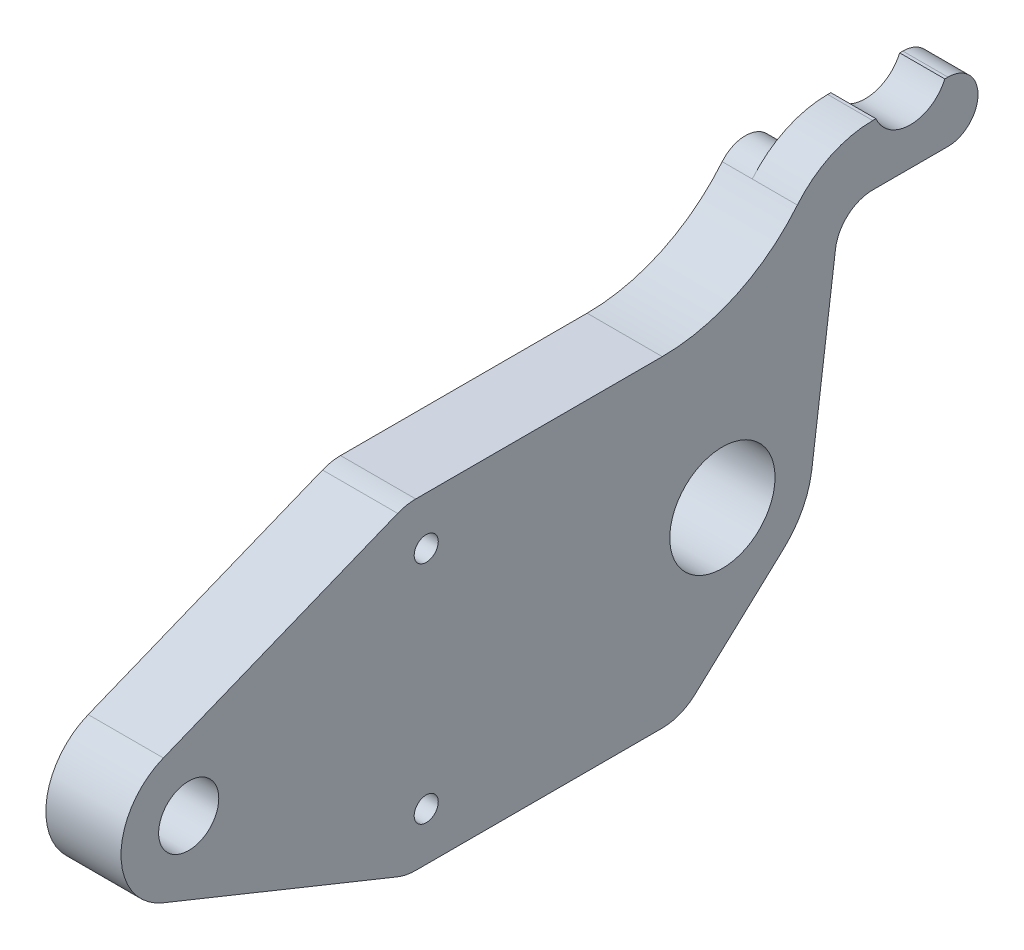
ISO-10303-21;
HEADER;
FILE_DESCRIPTION(('STEP AP214'),'2;1');
FILE_NAME('part.step','',(''),(''),'','','');
FILE_SCHEMA(('AUTOMOTIVE_DESIGN { 1 0 10303 214 1 1 1 1 }'));
ENDSEC;
DATA;
#1=APPLICATION_CONTEXT('core data for automotive mechanical design processes');
#2=APPLICATION_PROTOCOL_DEFINITION('international standard','automotive_design',2000,#1);
#3=PRODUCT_CONTEXT('',#1,'mechanical');
#4=PRODUCT('Part','Part','',(#3));
#5=PRODUCT_RELATED_PRODUCT_CATEGORY('part','',(#4));
#6=PRODUCT_DEFINITION_FORMATION('','',#4);
#7=PRODUCT_DEFINITION_CONTEXT('part definition',#1,'design');
#8=PRODUCT_DEFINITION('design','',#6,#7);
#9=PRODUCT_DEFINITION_SHAPE('','',#8);
#10=(LENGTH_UNIT() NAMED_UNIT(*) SI_UNIT(.MILLI.,.METRE.));
#11=(NAMED_UNIT(*) PLANE_ANGLE_UNIT() SI_UNIT($,.RADIAN.));
#12=(NAMED_UNIT(*) SI_UNIT($,.STERADIAN.) SOLID_ANGLE_UNIT());
#13=UNCERTAINTY_MEASURE_WITH_UNIT(LENGTH_MEASURE(1.E-05),#10,'distance_accuracy_value','');
#14=(GEOMETRIC_REPRESENTATION_CONTEXT(3) GLOBAL_UNCERTAINTY_ASSIGNED_CONTEXT((#13)) GLOBAL_UNIT_ASSIGNED_CONTEXT((#10,
#11,#12)) REPRESENTATION_CONTEXT('',''));
#15=CARTESIAN_POINT('',(0.,0.,0.));
#16=DIRECTION('',(0.,0.,1.));
#17=DIRECTION('',(1.,0.,0.));
#18=AXIS2_PLACEMENT_3D('',#15,#16,#17);
#19=CARTESIAN_POINT('',(32.5832179129826,7.5,-50.));
#20=DIRECTION('',(-1.,0.,0.));
#21=DIRECTION('',(0.,0.,1.));
#22=AXIS2_PLACEMENT_3D('',#19,#20,#21);
#23=CYLINDRICAL_SURFACE('',#22,2.49999999999999);
#24=CARTESIAN_POINT('',(-2.5,7.5,-50.));
#25=DIRECTION('',(1.,0.,0.));
#26=DIRECTION('',(0.,0.,-1.));
#27=AXIS2_PLACEMENT_3D('',#24,#25,#26);
#28=CIRCLE('',#27,2.49999999999999);
#29=CARTESIAN_POINT('',(-2.5,9.09083319418934,-48.0714643513107));
#30=VERTEX_POINT('',#29);
#31=CARTESIAN_POINT('',(-2.5,7.82729863047798,-47.5215174790838));
#32=VERTEX_POINT('',#31);
#33=EDGE_CURVE('E134',#30,#32,#28,.T.);
#34=ORIENTED_EDGE('',*,*,#33,.F.);
#35=DIRECTION('',(1.,0.,0.));
#36=VECTOR('',#35,1.);
#37=CARTESIAN_POINT('',(-2.5,9.09083319418934,-48.0714643513107));
#38=LINE('',#37,#36);
#39=CARTESIAN_POINT('',(-0.5,9.09083319418934,-48.0714643513107));
#40=VERTEX_POINT('',#39);
#41=EDGE_CURVE('E462',#30,#40,#38,.T.);
#42=ORIENTED_EDGE('',*,*,#41,.T.);
#43=CARTESIAN_POINT('',(-0.5,7.5,-50.));
#44=DIRECTION('',(1.,0.,0.));
#45=DIRECTION('',(0.,0.,-1.));
#46=AXIS2_PLACEMENT_3D('',#43,#44,#45);
#47=CIRCLE('',#46,2.49999999999999);
#48=CARTESIAN_POINT('',(-0.5,10.,-50.));
#49=VERTEX_POINT('',#48);
#50=EDGE_CURVE('E460',#40,#49,#47,.F.);
#51=ORIENTED_EDGE('',*,*,#50,.T.);
#52=DIRECTION('',(-1.,0.,0.));
#53=VECTOR('',#52,1.);
#54=CARTESIAN_POINT('',(32.5832179129826,10.,-50.));
#55=LINE('',#54,#53);
#56=CARTESIAN_POINT('',(2.5,10.,-50.));
#57=VERTEX_POINT('',#56);
#58=EDGE_CURVE('E194',#57,#49,#55,.T.);
#59=ORIENTED_EDGE('',*,*,#58,.F.);
#60=CARTESIAN_POINT('',(2.5,7.5,-50.));
#61=DIRECTION('',(1.,0.,0.));
#62=DIRECTION('',(0.,0.,-1.));
#63=AXIS2_PLACEMENT_3D('',#60,#61,#62);
#64=CIRCLE('',#63,2.49999999999999);
#65=CARTESIAN_POINT('',(2.5,7.82729863047798,-47.5215174790838));
#66=VERTEX_POINT('',#65);
#67=EDGE_CURVE('E197',#57,#66,#64,.T.);
#68=ORIENTED_EDGE('',*,*,#67,.T.);
#69=DIRECTION('',(-1.,0.,0.));
#70=VECTOR('',#69,1.);
#71=CARTESIAN_POINT('',(7.5,7.82729863047798,-47.5215174790838));
#72=LINE('',#71,#70);
#73=EDGE_CURVE('E339',#66,#32,#72,.T.);
#74=ORIENTED_EDGE('',*,*,#73,.T.);
#75=EDGE_LOOP('',(#34,#42,#51,#59,#68,#74));
#76=FACE_BOUND('',#75,.T.);
#77=ADVANCED_FACE('F119',(#76),#23,.F.);
#78=CARTESIAN_POINT('',(-2.5,14.,-46.));
#79=DIRECTION('',(-1.,0.,0.));
#80=DIRECTION('',(0.,0.,1.));
#81=AXIS2_PLACEMENT_3D('',#78,#79,#80);
#82=PLANE('',#81);
#83=CARTESIAN_POINT('',(-2.5,10.3634997495408,-46.5286358323593));
#84=DIRECTION('',(1.,0.,0.));
#85=DIRECTION('',(0.,0.,-1.));
#86=AXIS2_PLACEMENT_3D('',#83,#84,#85);
#87=CIRCLE('',#86,2.);
#88=CARTESIAN_POINT('',(-2.5,11.6361663048923,-44.9858073134079));
#89=VERTEX_POINT('',#88);
#90=EDGE_CURVE('E481',#89,#30,#87,.F.);
#91=ORIENTED_EDGE('',*,*,#90,.T.);
#92=ORIENTED_EDGE('',*,*,#33,.T.);
#93=DIRECTION('',(0.,-0.991393008366489,0.130919452191194));
#94=VECTOR('',#93,1.);
#95=CARTESIAN_POINT('',(-2.5,-6.03378357538272,-45.6910776092703));
#96=LINE('',#95,#94);
#97=CARTESIAN_POINT('',(-2.5,-4.08551671314716,-45.9483580501989));
#98=VERTEX_POINT('',#97);
#99=EDGE_CURVE('E332',#32,#98,#96,.T.);
#100=ORIENTED_EDGE('',*,*,#99,.T.);
#101=CARTESIAN_POINT('',(-2.5,-3.3,-40.));
#102=DIRECTION('',(-1.,0.,0.));
#103=DIRECTION('',(0.,0.,1.));
#104=AXIS2_PLACEMENT_3D('',#101,#102,#103);
#105=CIRCLE('',#104,6.);
#106=CARTESIAN_POINT('',(-2.5,-7.7098826045874,-44.0685298836014));
#107=VERTEX_POINT('',#106);
#108=EDGE_CURVE('E329',#98,#107,#105,.T.);
#109=ORIENTED_EDGE('',*,*,#108,.T.);
#110=DIRECTION('',(0.,-0.678088313933562,0.734980434097901));
#111=VECTOR('',#110,1.);
#112=CARTESIAN_POINT('',(-2.5,-26.1277959249238,-24.1053397663261));
#113=LINE('',#112,#111);
#114=CARTESIAN_POINT('',(-2.5,-13.1519373891133,-38.1698826045874));
#115=VERTEX_POINT('',#114);
#116=EDGE_CURVE('E326',#107,#115,#113,.T.);
#117=ORIENTED_EDGE('',*,*,#116,.T.);
#118=CARTESIAN_POINT('',(-2.5,-10.8,-36.));
#119=DIRECTION('',(-1.,0.,0.));
#120=DIRECTION('',(0.,0.,1.));
#121=AXIS2_PLACEMENT_3D('',#118,#119,#120);
#122=CIRCLE('',#121,3.2);
#123=CARTESIAN_POINT('',(-2.5,-14.,-36.));
#124=VERTEX_POINT('',#123);
#125=EDGE_CURVE('E323',#115,#124,#122,.T.);
#126=ORIENTED_EDGE('',*,*,#125,.T.);
#127=DIRECTION('',(0.,0.,1.));
#128=VECTOR('',#127,1.);
#129=CARTESIAN_POINT('',(-2.5,-14.,-46.));
#130=LINE('',#129,#128);
#131=CARTESIAN_POINT('',(-2.5,-14.,-19.6));
#132=VERTEX_POINT('',#131);
#133=EDGE_CURVE('E222',#124,#132,#130,.T.);
#134=ORIENTED_EDGE('',*,*,#133,.T.);
#135=CARTESIAN_POINT('',(-2.5,-10.8,-19.6));
#136=DIRECTION('',(-1.,0.,0.));
#137=DIRECTION('',(0.,0.,1.));
#138=AXIS2_PLACEMENT_3D('',#135,#136,#137);
#139=CIRCLE('',#138,3.20000000000001);
#140=CARTESIAN_POINT('',(-2.5,-13.7671794582083,-18.4017320571813));
#141=VERTEX_POINT('',#140);
#142=EDGE_CURVE('E300',#132,#141,#139,.T.);
#143=ORIENTED_EDGE('',*,*,#142,.T.);
#144=DIRECTION('',(0.,0.374458732130836,0.927243580690083));
#145=VECTOR('',#144,1.);
#146=CARTESIAN_POINT('',(-2.5,-5.44740723407007,2.19988495876361));
#147=LINE('',#146,#145);
#148=CARTESIAN_POINT('',(-2.5,-7.47259611310538,-2.81493570541124));
#149=VERTEX_POINT('',#148);
#150=EDGE_CURVE('E306',#141,#149,#147,.T.);
#151=ORIENTED_EDGE('',*,*,#150,.T.);
#152=CARTESIAN_POINT('',(-2.5,-3.3,-4.5));
#153=DIRECTION('',(-1.,0.,0.));
#154=DIRECTION('',(0.,0.,1.));
#155=AXIS2_PLACEMENT_3D('',#152,#153,#154);
#156=CIRCLE('',#155,4.5);
#157=CARTESIAN_POINT('',(-2.5,0.872596113105377,-2.81493570541124));
#158=VERTEX_POINT('',#157);
#159=EDGE_CURVE('E303',#149,#158,#156,.T.);
#160=ORIENTED_EDGE('',*,*,#159,.T.);
#161=DIRECTION('',(0.,0.374458732130836,-0.927243580690083));
#162=VECTOR('',#161,1.);
#163=CARTESIAN_POINT('',(-2.5,-0.227145108274306,-0.091730448207381));
#164=LINE('',#163,#162);
#165=CARTESIAN_POINT('',(-2.5,7.16717945820827,-18.4017320571813));
#166=VERTEX_POINT('',#165);
#167=EDGE_CURVE('E289',#158,#166,#164,.T.);
#168=ORIENTED_EDGE('',*,*,#167,.T.);
#169=CARTESIAN_POINT('',(-2.5,4.2,-19.6));
#170=DIRECTION('',(-1.,0.,0.));
#171=DIRECTION('',(0.,0.,1.));
#172=AXIS2_PLACEMENT_3D('',#169,#170,#171);
#173=CIRCLE('',#172,3.2);
#174=CARTESIAN_POINT('',(-2.5,7.4,-19.6));
#175=VERTEX_POINT('',#174);
#176=EDGE_CURVE('E285',#166,#175,#173,.T.);
#177=ORIENTED_EDGE('',*,*,#176,.T.);
#178=DIRECTION('',(0.,0.,-1.));
#179=VECTOR('',#178,1.);
#180=CARTESIAN_POINT('',(-2.5,7.4,0.));
#181=LINE('',#180,#179);
#182=CARTESIAN_POINT('',(-2.5,7.4,-36.));
#183=VERTEX_POINT('',#182);
#184=EDGE_CURVE('E273',#175,#183,#181,.T.);
#185=ORIENTED_EDGE('',*,*,#184,.T.);
#186=CARTESIAN_POINT('',(-2.5,19.0484848484848,-36.));
#187=DIRECTION('',(-1.,0.,0.));
#188=DIRECTION('',(0.,0.,1.));
#189=AXIS2_PLACEMENT_3D('',#186,#187,#188);
#190=CIRCLE('',#189,11.6484848484848);
#191=EDGE_CURVE('E275',#183,#89,#190,.F.);
#192=ORIENTED_EDGE('',*,*,#191,.T.);
#193=EDGE_LOOP('',(#91,#92,#100,#109,#117,#126,#134,#143,#151,#160,#168,#177,#185,#192));
#194=FACE_BOUND('',#193,.T.);
#195=CARTESIAN_POINT('',(-2.5,-3.3,-4.5));
#196=DIRECTION('',(1.,0.,0.));
#197=DIRECTION('',(0.,0.,-1.));
#198=AXIS2_PLACEMENT_3D('',#195,#196,#197);
#199=CIRCLE('',#198,2.);
#200=CARTESIAN_POINT('',(-2.5,-3.3,-6.5));
#201=VERTEX_POINT('',#200);
#202=EDGE_CURVE('E219',#201,#201,#199,.T.);
#203=ORIENTED_EDGE('',*,*,#202,.T.);
#204=EDGE_LOOP('',(#203));
#205=FACE_BOUND('',#204,.T.);
#206=CARTESIAN_POINT('',(-2.5,-3.3,-40.));
#207=DIRECTION('',(1.,0.,0.));
#208=DIRECTION('',(0.,0.,-1.));
#209=AXIS2_PLACEMENT_3D('',#206,#207,#208);
#210=CIRCLE('',#209,3.5);
#211=CARTESIAN_POINT('',(-2.5,-3.3,-43.5));
#212=VERTEX_POINT('',#211);
#213=EDGE_CURVE('E213',#212,#212,#210,.T.);
#214=ORIENTED_EDGE('',*,*,#213,.T.);
#215=EDGE_LOOP('',(#214));
#216=FACE_BOUND('',#215,.T.);
#217=CARTESIAN_POINT('',(-2.5,-10.8,-20.3));
#218=DIRECTION('',(1.,0.,0.));
#219=DIRECTION('',(0.,0.,-1.));
#220=AXIS2_PLACEMENT_3D('',#217,#218,#219);
#221=CIRCLE('',#220,0.799999999999999);
#222=CARTESIAN_POINT('',(-2.5,-10.8,-21.1));
#223=VERTEX_POINT('',#222);
#224=EDGE_CURVE('E209',#223,#223,#221,.T.);
#225=ORIENTED_EDGE('',*,*,#224,.T.);
#226=EDGE_LOOP('',(#225));
#227=FACE_BOUND('',#226,.T.);
#228=CARTESIAN_POINT('',(-2.5,4.2,-20.3));
#229=DIRECTION('',(1.,0.,0.));
#230=DIRECTION('',(0.,0.,-1.));
#231=AXIS2_PLACEMENT_3D('',#228,#229,#230);
#232=CIRCLE('',#231,0.799999999999999);
#233=CARTESIAN_POINT('',(-2.5,4.2,-21.1));
#234=VERTEX_POINT('',#233);
#235=EDGE_CURVE('E203',#234,#234,#232,.T.);
#236=ORIENTED_EDGE('',*,*,#235,.T.);
#237=EDGE_LOOP('',(#236));
#238=FACE_BOUND('',#237,.T.);
#239=ADVANCED_FACE('F121',(#194,#205,#216,#227,#238),#82,.T.);
#240=CARTESIAN_POINT('',(2.5,14.,-46.));
#241=DIRECTION('',(1.,0.,0.));
#242=DIRECTION('',(0.,0.,-1.));
#243=AXIS2_PLACEMENT_3D('',#240,#241,#242);
#244=PLANE('',#243);
#245=CARTESIAN_POINT('',(2.5,-3.3,-4.5));
#246=DIRECTION('',(1.,0.,0.));
#247=DIRECTION('',(0.,0.,-1.));
#248=AXIS2_PLACEMENT_3D('',#245,#246,#247);
#249=CIRCLE('',#248,2.);
#250=CARTESIAN_POINT('',(2.5,-3.3,-6.5));
#251=VERTEX_POINT('',#250);
#252=EDGE_CURVE('E216',#251,#251,#249,.T.);
#253=ORIENTED_EDGE('',*,*,#252,.F.);
#254=EDGE_LOOP('',(#253));
#255=FACE_BOUND('',#254,.T.);
#256=CARTESIAN_POINT('',(2.5,-3.3,-40.));
#257=DIRECTION('',(1.,0.,0.));
#258=DIRECTION('',(0.,0.,-1.));
#259=AXIS2_PLACEMENT_3D('',#256,#257,#258);
#260=CIRCLE('',#259,3.5);
#261=CARTESIAN_POINT('',(2.5,-3.3,-43.5));
#262=VERTEX_POINT('',#261);
#263=EDGE_CURVE('E212',#262,#262,#260,.T.);
#264=ORIENTED_EDGE('',*,*,#263,.F.);
#265=EDGE_LOOP('',(#264));
#266=FACE_BOUND('',#265,.T.);
#267=CARTESIAN_POINT('',(2.5,-10.8,-20.3));
#268=DIRECTION('',(1.,0.,0.));
#269=DIRECTION('',(0.,0.,-1.));
#270=AXIS2_PLACEMENT_3D('',#267,#268,#269);
#271=CIRCLE('',#270,0.799999999999988);
#272=CARTESIAN_POINT('',(2.5,-10.8,-21.1));
#273=VERTEX_POINT('',#272);
#274=EDGE_CURVE('E206',#273,#273,#271,.T.);
#275=ORIENTED_EDGE('',*,*,#274,.F.);
#276=EDGE_LOOP('',(#275));
#277=FACE_BOUND('',#276,.T.);
#278=CARTESIAN_POINT('',(2.5,4.2,-20.3));
#279=DIRECTION('',(1.,0.,0.));
#280=DIRECTION('',(0.,0.,-1.));
#281=AXIS2_PLACEMENT_3D('',#278,#279,#280);
#282=CIRCLE('',#281,0.799999999999988);
#283=CARTESIAN_POINT('',(2.5,4.2,-21.1));
#284=VERTEX_POINT('',#283);
#285=EDGE_CURVE('E200',#284,#284,#282,.T.);
#286=ORIENTED_EDGE('',*,*,#285,.F.);
#287=EDGE_LOOP('',(#286));
#288=FACE_BOUND('',#287,.T.);
#289=DIRECTION('',(0.,0.,1.));
#290=VECTOR('',#289,1.);
#291=CARTESIAN_POINT('',(2.5,14.,-46.));
#292=LINE('',#291,#290);
#293=CARTESIAN_POINT('',(2.5,14.,-50.2087121525221));
#294=VERTEX_POINT('',#293);
#295=CARTESIAN_POINT('',(2.5,14.,-50.));
#296=VERTEX_POINT('',#295);
#297=EDGE_CURVE('E143',#294,#296,#292,.T.);
#298=ORIENTED_EDGE('',*,*,#297,.T.);
#299=CARTESIAN_POINT('',(2.5,7.5,-50.));
#300=DIRECTION('',(1.,0.,0.));
#301=DIRECTION('',(0.,0.,-1.));
#302=AXIS2_PLACEMENT_3D('',#299,#300,#301);
#303=CIRCLE('',#302,6.5);
#304=CARTESIAN_POINT('',(2.5,11.6361663048923,-44.9858073134079));
#305=VERTEX_POINT('',#304);
#306=EDGE_CURVE('E297',#296,#305,#303,.T.);
#307=ORIENTED_EDGE('',*,*,#306,.T.);
#308=CARTESIAN_POINT('',(2.5,19.0484848484848,-36.));
#309=DIRECTION('',(1.,0.,0.));
#310=DIRECTION('',(0.,0.,-1.));
#311=AXIS2_PLACEMENT_3D('',#308,#309,#310);
#312=CIRCLE('',#311,11.6484848484848);
#313=CARTESIAN_POINT('',(2.5,7.4,-36.));
#314=VERTEX_POINT('',#313);
#315=EDGE_CURVE('E240',#305,#314,#312,.F.);
#316=ORIENTED_EDGE('',*,*,#315,.T.);
#317=DIRECTION('',(0.,0.,1.));
#318=VECTOR('',#317,1.);
#319=CARTESIAN_POINT('',(2.5,7.4,-46.));
#320=LINE('',#319,#318);
#321=CARTESIAN_POINT('',(2.5,7.4,-19.6));
#322=VERTEX_POINT('',#321);
#323=EDGE_CURVE('E243',#314,#322,#320,.T.);
#324=ORIENTED_EDGE('',*,*,#323,.T.);
#325=CARTESIAN_POINT('',(2.5,4.2,-19.6));
#326=DIRECTION('',(1.,0.,0.));
#327=DIRECTION('',(0.,0.,-1.));
#328=AXIS2_PLACEMENT_3D('',#325,#326,#327);
#329=CIRCLE('',#328,3.2);
#330=CARTESIAN_POINT('',(2.5,7.16717945820827,-18.4017320571813));
#331=VERTEX_POINT('',#330);
#332=EDGE_CURVE('E127',#322,#331,#329,.T.);
#333=ORIENTED_EDGE('',*,*,#332,.T.);
#334=DIRECTION('',(0.,-0.374458732130836,0.927243580690083));
#335=VECTOR('',#334,1.);
#336=CARTESIAN_POINT('',(2.5,17.7077906383687,-44.5026430914552));
#337=LINE('',#336,#335);
#338=CARTESIAN_POINT('',(2.5,0.872596113105377,-2.81493570541124));
#339=VERTEX_POINT('',#338);
#340=EDGE_CURVE('E12',#331,#339,#337,.T.);
#341=ORIENTED_EDGE('',*,*,#340,.T.);
#342=CARTESIAN_POINT('',(2.5,-3.3,-4.5));
#343=DIRECTION('',(1.,0.,0.));
#344=DIRECTION('',(0.,0.,-1.));
#345=AXIS2_PLACEMENT_3D('',#342,#343,#344);
#346=CIRCLE('',#345,4.5);
#347=CARTESIAN_POINT('',(2.5,-7.47259611310538,-2.81493570541124));
#348=VERTEX_POINT('',#347);
#349=EDGE_CURVE('E313',#339,#348,#346,.T.);
#350=ORIENTED_EDGE('',*,*,#349,.T.);
#351=DIRECTION('',(0.,-0.374458732130836,-0.927243580690083));
#352=VECTOR('',#351,1.);
#353=CARTESIAN_POINT('',(2.5,-19.4562014027802,-32.4890229276375));
#354=LINE('',#353,#352);
#355=CARTESIAN_POINT('',(2.5,-13.7671794582083,-18.4017320571813));
#356=VERTEX_POINT('',#355);
#357=EDGE_CURVE('E237',#348,#356,#354,.T.);
#358=ORIENTED_EDGE('',*,*,#357,.T.);
#359=CARTESIAN_POINT('',(2.5,-10.8,-19.6));
#360=DIRECTION('',(1.,0.,0.));
#361=DIRECTION('',(0.,0.,-1.));
#362=AXIS2_PLACEMENT_3D('',#359,#360,#361);
#363=CIRCLE('',#362,3.20000000000001);
#364=CARTESIAN_POINT('',(2.5,-14.,-19.6));
#365=VERTEX_POINT('',#364);
#366=EDGE_CURVE('E320',#356,#365,#363,.T.);
#367=ORIENTED_EDGE('',*,*,#366,.T.);
#368=DIRECTION('',(0.,0.,1.));
#369=VECTOR('',#368,1.);
#370=CARTESIAN_POINT('',(2.5,-14.,-46.));
#371=LINE('',#370,#369);
#372=CARTESIAN_POINT('',(2.5,-14.,-36.));
#373=VERTEX_POINT('',#372);
#374=EDGE_CURVE('E227',#373,#365,#371,.T.);
#375=ORIENTED_EDGE('',*,*,#374,.F.);
#376=CARTESIAN_POINT('',(2.5,-10.8,-36.));
#377=DIRECTION('',(1.,0.,0.));
#378=DIRECTION('',(0.,0.,-1.));
#379=AXIS2_PLACEMENT_3D('',#376,#377,#378);
#380=CIRCLE('',#379,3.2);
#381=CARTESIAN_POINT('',(2.5,-13.1519373891133,-38.1698826045874));
#382=VERTEX_POINT('',#381);
#383=EDGE_CURVE('E352',#373,#382,#380,.T.);
#384=ORIENTED_EDGE('',*,*,#383,.T.);
#385=DIRECTION('',(0.,0.678088313933562,-0.734980434097901));
#386=VECTOR('',#385,1.);
#387=CARTESIAN_POINT('',(2.5,3.23501232923563,-55.9317097442785));
#388=LINE('',#387,#386);
#389=CARTESIAN_POINT('',(2.5,-7.7098826045874,-44.0685298836014));
#390=VERTEX_POINT('',#389);
#391=EDGE_CURVE('E226',#382,#390,#388,.T.);
#392=ORIENTED_EDGE('',*,*,#391,.T.);
#393=CARTESIAN_POINT('',(2.5,-3.3,-40.));
#394=DIRECTION('',(1.,0.,0.));
#395=DIRECTION('',(0.,0.,-1.));
#396=AXIS2_PLACEMENT_3D('',#393,#394,#395);
#397=CIRCLE('',#396,6.);
#398=CARTESIAN_POINT('',(2.5,-4.08551671314716,-45.9483580501989));
#399=VERTEX_POINT('',#398);
#400=EDGE_CURVE('E234',#390,#399,#397,.T.);
#401=ORIENTED_EDGE('',*,*,#400,.T.);
#402=DIRECTION('',(0.,0.991393008366489,-0.130919452191194));
#403=VECTOR('',#402,1.);
#404=CARTESIAN_POINT('',(2.5,13.6967187429786,-48.2966099593855));
#405=LINE('',#404,#403);
#406=EDGE_CURVE('E338',#399,#66,#405,.T.);
#407=ORIENTED_EDGE('',*,*,#406,.T.);
#408=ORIENTED_EDGE('',*,*,#67,.F.);
#409=DIRECTION('',(0.,0.,1.));
#410=VECTOR('',#409,1.);
#411=CARTESIAN_POINT('',(2.5,10.,-55.));
#412=LINE('',#411,#410);
#413=CARTESIAN_POINT('',(2.5,10.,-55.));
#414=VERTEX_POINT('',#413);
#415=EDGE_CURVE('E167',#414,#57,#412,.T.);
#416=ORIENTED_EDGE('',*,*,#415,.F.);
#417=CARTESIAN_POINT('',(2.5,12.,-55.));
#418=DIRECTION('',(1.,0.,0.));
#419=DIRECTION('',(0.,0.,-1.));
#420=AXIS2_PLACEMENT_3D('',#417,#418,#419);
#421=CIRCLE('',#420,2.);
#422=CARTESIAN_POINT('',(2.5,14.,-55.));
#423=VERTEX_POINT('',#422);
#424=EDGE_CURVE('E160',#423,#414,#421,.F.);
#425=ORIENTED_EDGE('',*,*,#424,.F.);
#426=DIRECTION('',(0.,0.,-1.));
#427=VECTOR('',#426,1.);
#428=CARTESIAN_POINT('',(2.5,14.,-54.7912878474779));
#429=LINE('',#428,#427);
#430=CARTESIAN_POINT('',(2.5,14.,-54.7912878474779));
#431=VERTEX_POINT('',#430);
#432=EDGE_CURVE('E164',#431,#423,#429,.T.);
#433=ORIENTED_EDGE('',*,*,#432,.F.);
#434=CARTESIAN_POINT('',(2.5,15.,-52.5));
#435=DIRECTION('',(1.,0.,0.));
#436=DIRECTION('',(0.,0.,-1.));
#437=AXIS2_PLACEMENT_3D('',#434,#435,#436);
#438=CIRCLE('',#437,2.5);
#439=EDGE_CURVE('E188',#294,#431,#438,.T.);
#440=ORIENTED_EDGE('',*,*,#439,.F.);
#441=EDGE_LOOP('',(#298,#307,#316,#324,#333,#341,#350,#358,#367,#375,#384,#392,#401,#407,#408,
#416,#425,#433,#440));
#442=FACE_BOUND('',#441,.T.);
#443=ADVANCED_FACE('F162',(#255,#266,#277,#288,#442),#244,.T.);
#444=CARTESIAN_POINT('',(-2.5,-14.,-46.));
#445=DIRECTION('',(0.,-1.,0.));
#446=DIRECTION('',(0.,0.,-1.));
#447=AXIS2_PLACEMENT_3D('',#444,#445,#446);
#448=PLANE('',#447);
#449=ORIENTED_EDGE('',*,*,#374,.T.);
#450=DIRECTION('',(-1.,0.,0.));
#451=VECTOR('',#450,1.);
#452=CARTESIAN_POINT('',(7.5,-14.,-19.6));
#453=LINE('',#452,#451);
#454=EDGE_CURVE('E309',#365,#132,#453,.T.);
#455=ORIENTED_EDGE('',*,*,#454,.T.);
#456=ORIENTED_EDGE('',*,*,#133,.F.);
#457=DIRECTION('',(-1.,0.,0.));
#458=VECTOR('',#457,1.);
#459=CARTESIAN_POINT('',(7.5,-14.,-36.));
#460=LINE('',#459,#458);
#461=EDGE_CURVE('E335',#373,#124,#460,.T.);
#462=ORIENTED_EDGE('',*,*,#461,.F.);
#463=EDGE_LOOP('',(#449,#455,#456,#462));
#464=FACE_BOUND('',#463,.T.);
#465=ADVANCED_FACE('F452',(#464),#448,.T.);
#466=CARTESIAN_POINT('',(-2.5,14.,-46.));
#467=DIRECTION('',(0.,1.,0.));
#468=DIRECTION('',(0.,0.,1.));
#469=AXIS2_PLACEMENT_3D('',#466,#467,#468);
#470=PLANE('',#469);
#471=DIRECTION('',(0.,0.,1.));
#472=VECTOR('',#471,1.);
#473=CARTESIAN_POINT('',(-0.5,14.,0.));
#474=LINE('',#473,#472);
#475=CARTESIAN_POINT('',(-0.5,14.,-50.2087121525221));
#476=VERTEX_POINT('',#475);
#477=CARTESIAN_POINT('',(-0.5,14.,-50.));
#478=VERTEX_POINT('',#477);
#479=EDGE_CURVE('E478',#476,#478,#474,.T.);
#480=ORIENTED_EDGE('',*,*,#479,.T.);
#481=DIRECTION('',(-1.,0.,0.));
#482=VECTOR('',#481,1.);
#483=CARTESIAN_POINT('',(7.5,14.,-50.));
#484=LINE('',#483,#482);
#485=EDGE_CURVE('E290',#296,#478,#484,.T.);
#486=ORIENTED_EDGE('',*,*,#485,.F.);
#487=ORIENTED_EDGE('',*,*,#297,.F.);
#488=DIRECTION('',(-1.,0.,0.));
#489=VECTOR('',#488,1.);
#490=CARTESIAN_POINT('',(32.5832179129826,14.,-50.2087121525221));
#491=LINE('',#490,#489);
#492=EDGE_CURVE('E193',#294,#476,#491,.T.);
#493=ORIENTED_EDGE('',*,*,#492,.T.);
#494=EDGE_LOOP('',(#480,#486,#487,#493));
#495=FACE_BOUND('',#494,.T.);
#496=ADVANCED_FACE('F499',(#495),#470,.T.);
#497=CARTESIAN_POINT('',(-2.5,-3.3,-4.5));
#498=DIRECTION('',(1.,0.,0.));
#499=DIRECTION('',(0.,0.,-1.));
#500=AXIS2_PLACEMENT_3D('',#497,#498,#499);
#501=CYLINDRICAL_SURFACE('',#500,2.);
#502=ORIENTED_EDGE('',*,*,#202,.F.);
#503=EDGE_LOOP('',(#502));
#504=FACE_BOUND('',#503,.T.);
#505=ORIENTED_EDGE('',*,*,#252,.T.);
#506=EDGE_LOOP('',(#505));
#507=FACE_BOUND('',#506,.T.);
#508=ADVANCED_FACE('F541',(#504,#507),#501,.F.);
#509=CARTESIAN_POINT('',(-2.5,-3.3,-40.));
#510=DIRECTION('',(1.,0.,0.));
#511=DIRECTION('',(0.,0.,-1.));
#512=AXIS2_PLACEMENT_3D('',#509,#510,#511);
#513=CYLINDRICAL_SURFACE('',#512,3.5);
#514=ORIENTED_EDGE('',*,*,#213,.F.);
#515=EDGE_LOOP('',(#514));
#516=FACE_BOUND('',#515,.T.);
#517=ORIENTED_EDGE('',*,*,#263,.T.);
#518=EDGE_LOOP('',(#517));
#519=FACE_BOUND('',#518,.T.);
#520=ADVANCED_FACE('F537',(#516,#519),#513,.F.);
#521=CARTESIAN_POINT('',(2.5,-10.8,-20.3));
#522=DIRECTION('',(1.,0.,0.));
#523=DIRECTION('',(0.,0.,-1.));
#524=AXIS2_PLACEMENT_3D('',#521,#522,#523);
#525=CYLINDRICAL_SURFACE('',#524,0.799999999999993);
#526=ORIENTED_EDGE('',*,*,#224,.F.);
#527=EDGE_LOOP('',(#526));
#528=FACE_BOUND('',#527,.T.);
#529=ORIENTED_EDGE('',*,*,#274,.T.);
#530=EDGE_LOOP('',(#529));
#531=FACE_BOUND('',#530,.T.);
#532=ADVANCED_FACE('F533',(#528,#531),#525,.F.);
#533=CARTESIAN_POINT('',(2.5,4.2,-20.3));
#534=DIRECTION('',(1.,0.,0.));
#535=DIRECTION('',(0.,0.,-1.));
#536=AXIS2_PLACEMENT_3D('',#533,#534,#535);
#537=CYLINDRICAL_SURFACE('',#536,0.799999999999993);
#538=ORIENTED_EDGE('',*,*,#235,.F.);
#539=EDGE_LOOP('',(#538));
#540=FACE_BOUND('',#539,.T.);
#541=ORIENTED_EDGE('',*,*,#285,.T.);
#542=EDGE_LOOP('',(#541));
#543=FACE_BOUND('',#542,.T.);
#544=ADVANCED_FACE('F530',(#540,#543),#537,.F.);
#545=CARTESIAN_POINT('',(32.5832179129826,15.,-52.5));
#546=DIRECTION('',(-1.,0.,0.));
#547=DIRECTION('',(0.,0.,1.));
#548=AXIS2_PLACEMENT_3D('',#545,#546,#547);
#549=CYLINDRICAL_SURFACE('',#548,2.5);
#550=CARTESIAN_POINT('',(-0.5,15.,-52.5));
#551=DIRECTION('',(1.,0.,0.));
#552=DIRECTION('',(0.,0.,-1.));
#553=AXIS2_PLACEMENT_3D('',#550,#551,#552);
#554=CIRCLE('',#553,2.5);
#555=CARTESIAN_POINT('',(-0.5,14.,-54.7912878474779));
#556=VERTEX_POINT('',#555);
#557=EDGE_CURVE('E475',#556,#476,#554,.F.);
#558=ORIENTED_EDGE('',*,*,#557,.T.);
#559=ORIENTED_EDGE('',*,*,#492,.F.);
#560=ORIENTED_EDGE('',*,*,#439,.T.);
#561=DIRECTION('',(-1.,0.,0.));
#562=VECTOR('',#561,1.);
#563=CARTESIAN_POINT('',(32.5832179129826,14.,-54.7912878474779));
#564=LINE('',#563,#562);
#565=EDGE_CURVE('E185',#431,#556,#564,.T.);
#566=ORIENTED_EDGE('',*,*,#565,.T.);
#567=EDGE_LOOP('',(#558,#559,#560,#566));
#568=FACE_BOUND('',#567,.T.);
#569=ADVANCED_FACE('F498',(#568),#549,.F.);
#570=CARTESIAN_POINT('',(32.5832179129826,14.,-54.7912878474779));
#571=DIRECTION('',(0.,1.,0.));
#572=DIRECTION('',(0.,0.,1.));
#573=AXIS2_PLACEMENT_3D('',#570,#571,#572);
#574=PLANE('',#573);
#575=DIRECTION('',(0.,0.,1.));
#576=VECTOR('',#575,1.);
#577=CARTESIAN_POINT('',(-0.5,13.9999999999995,1.1636183312855E-13));
#578=LINE('',#577,#576);
#579=CARTESIAN_POINT('',(-0.5,14.,-55.));
#580=VERTEX_POINT('',#579);
#581=EDGE_CURVE('E473',#580,#556,#578,.T.);
#582=ORIENTED_EDGE('',*,*,#581,.T.);
#583=ORIENTED_EDGE('',*,*,#565,.F.);
#584=ORIENTED_EDGE('',*,*,#432,.T.);
#585=DIRECTION('',(-1.,0.,0.));
#586=VECTOR('',#585,1.);
#587=CARTESIAN_POINT('',(32.5832179129826,14.,-55.));
#588=LINE('',#587,#586);
#589=EDGE_CURVE('E172',#423,#580,#588,.T.);
#590=ORIENTED_EDGE('',*,*,#589,.T.);
#591=EDGE_LOOP('',(#582,#583,#584,#590));
#592=FACE_BOUND('',#591,.T.);
#593=ADVANCED_FACE('F183',(#592),#574,.T.);
#594=CARTESIAN_POINT('',(32.5832179129826,12.,-55.));
#595=DIRECTION('',(-1.,0.,0.));
#596=DIRECTION('',(0.,0.,1.));
#597=AXIS2_PLACEMENT_3D('',#594,#595,#596);
#598=CYLINDRICAL_SURFACE('',#597,2.);
#599=CARTESIAN_POINT('',(-0.5,12.,-55.));
#600=DIRECTION('',(1.,0.,0.));
#601=DIRECTION('',(0.,0.,-1.));
#602=AXIS2_PLACEMENT_3D('',#599,#600,#601);
#603=CIRCLE('',#602,2.);
#604=CARTESIAN_POINT('',(-0.5,10.,-55.));
#605=VERTEX_POINT('',#604);
#606=EDGE_CURVE('E179',#605,#580,#603,.T.);
#607=ORIENTED_EDGE('',*,*,#606,.T.);
#608=ORIENTED_EDGE('',*,*,#589,.F.);
#609=ORIENTED_EDGE('',*,*,#424,.T.);
#610=DIRECTION('',(-1.,0.,0.));
#611=VECTOR('',#610,1.);
#612=CARTESIAN_POINT('',(32.5832179129826,10.,-55.));
#613=LINE('',#612,#611);
#614=EDGE_CURVE('E171',#414,#605,#613,.T.);
#615=ORIENTED_EDGE('',*,*,#614,.T.);
#616=EDGE_LOOP('',(#607,#608,#609,#615));
#617=FACE_BOUND('',#616,.T.);
#618=ADVANCED_FACE('F176',(#617),#598,.T.);
#619=CARTESIAN_POINT('',(32.5832179129826,10.,-55.));
#620=DIRECTION('',(0.,-1.,0.));
#621=DIRECTION('',(0.,0.,-1.));
#622=AXIS2_PLACEMENT_3D('',#619,#620,#621);
#623=PLANE('',#622);
#624=DIRECTION('',(0.,0.,-1.));
#625=VECTOR('',#624,1.);
#626=CARTESIAN_POINT('',(-0.5,9.99999999999998,0.));
#627=LINE('',#626,#625);
#628=EDGE_CURVE('E364',#49,#605,#627,.T.);
#629=ORIENTED_EDGE('',*,*,#628,.T.);
#630=ORIENTED_EDGE('',*,*,#614,.F.);
#631=ORIENTED_EDGE('',*,*,#415,.T.);
#632=ORIENTED_EDGE('',*,*,#58,.T.);
#633=EDGE_LOOP('',(#629,#630,#631,#632));
#634=FACE_BOUND('',#633,.T.);
#635=ADVANCED_FACE('F359',(#634),#623,.T.);
#636=CARTESIAN_POINT('',(7.5,-10.8,-36.));
#637=DIRECTION('',(-1.,0.,0.));
#638=DIRECTION('',(0.,0.,1.));
#639=AXIS2_PLACEMENT_3D('',#636,#637,#638);
#640=CYLINDRICAL_SURFACE('',#639,3.2);
#641=ORIENTED_EDGE('',*,*,#461,.T.);
#642=ORIENTED_EDGE('',*,*,#125,.F.);
#643=DIRECTION('',(-1.,0.,0.));
#644=VECTOR('',#643,1.);
#645=CARTESIAN_POINT('',(7.5,-13.1519373891133,-38.1698826045874));
#646=LINE('',#645,#644);
#647=EDGE_CURVE('E334',#382,#115,#646,.T.);
#648=ORIENTED_EDGE('',*,*,#647,.F.);
#649=ORIENTED_EDGE('',*,*,#383,.F.);
#650=EDGE_LOOP('',(#641,#642,#648,#649));
#651=FACE_BOUND('',#650,.T.);
#652=ADVANCED_FACE('F448',(#651),#640,.T.);
#653=CARTESIAN_POINT('',(7.5,-6.03378357538272,-45.6910776092703));
#654=DIRECTION('',(0.,-0.130919452191194,-0.991393008366489));
#655=DIRECTION('',(0.,0.991393008366489,-0.130919452191194));
#656=AXIS2_PLACEMENT_3D('',#653,#654,#655);
#657=PLANE('',#656);
#658=DIRECTION('',(-1.,0.,0.));
#659=VECTOR('',#658,1.);
#660=CARTESIAN_POINT('',(7.5,-4.08551671314716,-45.9483580501989));
#661=LINE('',#660,#659);
#662=EDGE_CURVE('E342',#399,#98,#661,.T.);
#663=ORIENTED_EDGE('',*,*,#662,.T.);
#664=ORIENTED_EDGE('',*,*,#99,.F.);
#665=ORIENTED_EDGE('',*,*,#73,.F.);
#666=ORIENTED_EDGE('',*,*,#406,.F.);
#667=EDGE_LOOP('',(#663,#664,#665,#666));
#668=FACE_BOUND('',#667,.T.);
#669=ADVANCED_FACE('F455',(#668),#657,.T.);
#670=CARTESIAN_POINT('',(7.5,-3.3,-40.));
#671=DIRECTION('',(-1.,0.,0.));
#672=DIRECTION('',(0.,0.,1.));
#673=AXIS2_PLACEMENT_3D('',#670,#671,#672);
#674=CYLINDRICAL_SURFACE('',#673,6.);
#675=DIRECTION('',(-1.,0.,0.));
#676=VECTOR('',#675,1.);
#677=CARTESIAN_POINT('',(7.5,-7.7098826045874,-44.0685298836014));
#678=LINE('',#677,#676);
#679=EDGE_CURVE('E345',#390,#107,#678,.T.);
#680=ORIENTED_EDGE('',*,*,#679,.T.);
#681=ORIENTED_EDGE('',*,*,#108,.F.);
#682=ORIENTED_EDGE('',*,*,#662,.F.);
#683=ORIENTED_EDGE('',*,*,#400,.F.);
#684=EDGE_LOOP('',(#680,#681,#682,#683));
#685=FACE_BOUND('',#684,.T.);
#686=ADVANCED_FACE('F441',(#685),#674,.T.);
#687=CARTESIAN_POINT('',(7.5,-26.1277959249238,-24.1053397663261));
#688=DIRECTION('',(0.,-0.734980434097901,-0.678088313933562));
#689=DIRECTION('',(0.,0.678088313933562,-0.734980434097901));
#690=AXIS2_PLACEMENT_3D('',#687,#688,#689);
#691=PLANE('',#690);
#692=ORIENTED_EDGE('',*,*,#647,.T.);
#693=ORIENTED_EDGE('',*,*,#116,.F.);
#694=ORIENTED_EDGE('',*,*,#679,.F.);
#695=ORIENTED_EDGE('',*,*,#391,.F.);
#696=EDGE_LOOP('',(#692,#693,#694,#695));
#697=FACE_BOUND('',#696,.T.);
#698=ADVANCED_FACE('F444',(#697),#691,.T.);
#699=CARTESIAN_POINT('',(7.5,-10.8,-19.6));
#700=DIRECTION('',(-1.,0.,0.));
#701=DIRECTION('',(0.,0.,1.));
#702=AXIS2_PLACEMENT_3D('',#699,#700,#701);
#703=CYLINDRICAL_SURFACE('',#702,3.20000000000001);
#704=DIRECTION('',(-1.,0.,0.));
#705=VECTOR('',#704,1.);
#706=CARTESIAN_POINT('',(7.5,-13.7671794582083,-18.4017320571813));
#707=LINE('',#706,#705);
#708=EDGE_CURVE('E310',#356,#141,#707,.T.);
#709=ORIENTED_EDGE('',*,*,#708,.T.);
#710=ORIENTED_EDGE('',*,*,#142,.F.);
#711=ORIENTED_EDGE('',*,*,#454,.F.);
#712=ORIENTED_EDGE('',*,*,#366,.F.);
#713=EDGE_LOOP('',(#709,#710,#711,#712));
#714=FACE_BOUND('',#713,.T.);
#715=ADVANCED_FACE('F617',(#714),#703,.T.);
#716=CARTESIAN_POINT('',(7.5,-5.44740723407007,2.19988495876361));
#717=DIRECTION('',(0.,-0.927243580690083,0.374458732130836));
#718=DIRECTION('',(0.,-0.374458732130836,-0.927243580690083));
#719=AXIS2_PLACEMENT_3D('',#716,#717,#718);
#720=PLANE('',#719);
#721=DIRECTION('',(-1.,0.,0.));
#722=VECTOR('',#721,1.);
#723=CARTESIAN_POINT('',(7.5,-7.47259611310538,-2.81493570541124));
#724=LINE('',#723,#722);
#725=EDGE_CURVE('E314',#348,#149,#724,.T.);
#726=ORIENTED_EDGE('',*,*,#725,.T.);
#727=ORIENTED_EDGE('',*,*,#150,.F.);
#728=ORIENTED_EDGE('',*,*,#708,.F.);
#729=ORIENTED_EDGE('',*,*,#357,.F.);
#730=EDGE_LOOP('',(#726,#727,#728,#729));
#731=FACE_BOUND('',#730,.T.);
#732=ADVANCED_FACE('F623',(#731),#720,.T.);
#733=CARTESIAN_POINT('',(7.5,-3.3,-4.5));
#734=DIRECTION('',(-1.,0.,0.));
#735=DIRECTION('',(0.,0.,1.));
#736=AXIS2_PLACEMENT_3D('',#733,#734,#735);
#737=CYLINDRICAL_SURFACE('',#736,4.5);
#738=ORIENTED_EDGE('',*,*,#349,.F.);
#739=DIRECTION('',(-1.,0.,0.));
#740=VECTOR('',#739,1.);
#741=CARTESIAN_POINT('',(7.5,0.872596113105377,-2.81493570541124));
#742=LINE('',#741,#740);
#743=EDGE_CURVE('E286',#339,#158,#742,.T.);
#744=ORIENTED_EDGE('',*,*,#743,.T.);
#745=ORIENTED_EDGE('',*,*,#159,.F.);
#746=ORIENTED_EDGE('',*,*,#725,.F.);
#747=EDGE_LOOP('',(#738,#744,#745,#746));
#748=FACE_BOUND('',#747,.T.);
#749=ADVANCED_FACE('F631',(#748),#737,.T.);
#750=CARTESIAN_POINT('',(7.5,7.5,-50.));
#751=DIRECTION('',(-1.,0.,0.));
#752=DIRECTION('',(0.,0.,1.));
#753=AXIS2_PLACEMENT_3D('',#750,#751,#752);
#754=CYLINDRICAL_SURFACE('',#753,6.5);
#755=CARTESIAN_POINT('',(-0.5,7.5,-50.));
#756=DIRECTION('',(1.,0.,0.));
#757=DIRECTION('',(0.,0.,-1.));
#758=AXIS2_PLACEMENT_3D('',#755,#756,#757);
#759=CIRCLE('',#758,6.5);
#760=CARTESIAN_POINT('',(-0.5,11.6361663048923,-44.9858073134079));
#761=VERTEX_POINT('',#760);
#762=EDGE_CURVE('E468',#478,#761,#759,.T.);
#763=ORIENTED_EDGE('',*,*,#762,.T.);
#764=DIRECTION('',(-1.,0.,0.));
#765=VECTOR('',#764,1.);
#766=CARTESIAN_POINT('',(7.5,11.6361663048923,-44.9858073134079));
#767=LINE('',#766,#765);
#768=EDGE_CURVE('E293',#305,#761,#767,.T.);
#769=ORIENTED_EDGE('',*,*,#768,.F.);
#770=ORIENTED_EDGE('',*,*,#306,.F.);
#771=ORIENTED_EDGE('',*,*,#485,.T.);
#772=EDGE_LOOP('',(#763,#769,#770,#771));
#773=FACE_BOUND('',#772,.T.);
#774=ADVANCED_FACE('F495',(#773),#754,.T.);
#775=CARTESIAN_POINT('',(7.5,-0.227145108274306,-0.091730448207381));
#776=DIRECTION('',(0.,0.927243580690083,0.374458732130836));
#777=DIRECTION('',(0.,-0.374458732130836,0.927243580690083));
#778=AXIS2_PLACEMENT_3D('',#775,#776,#777);
#779=PLANE('',#778);
#780=DIRECTION('',(-1.,0.,0.));
#781=VECTOR('',#780,1.);
#782=CARTESIAN_POINT('',(7.5,7.16717945820827,-18.4017320571813));
#783=LINE('',#782,#781);
#784=EDGE_CURVE('E265',#331,#166,#783,.T.);
#785=ORIENTED_EDGE('',*,*,#784,.T.);
#786=ORIENTED_EDGE('',*,*,#167,.F.);
#787=ORIENTED_EDGE('',*,*,#743,.F.);
#788=ORIENTED_EDGE('',*,*,#340,.F.);
#789=EDGE_LOOP('',(#785,#786,#787,#788));
#790=FACE_BOUND('',#789,.T.);
#791=ADVANCED_FACE('F646',(#790),#779,.T.);
#792=CARTESIAN_POINT('',(7.5,4.2,-19.6));
#793=DIRECTION('',(-1.,0.,0.));
#794=DIRECTION('',(0.,0.,1.));
#795=AXIS2_PLACEMENT_3D('',#792,#793,#794);
#796=CYLINDRICAL_SURFACE('',#795,3.2);
#797=DIRECTION('',(-1.,0.,0.));
#798=VECTOR('',#797,1.);
#799=CARTESIAN_POINT('',(7.5,7.4,-19.6));
#800=LINE('',#799,#798);
#801=EDGE_CURVE('E262',#322,#175,#800,.T.);
#802=ORIENTED_EDGE('',*,*,#801,.T.);
#803=ORIENTED_EDGE('',*,*,#176,.F.);
#804=ORIENTED_EDGE('',*,*,#784,.F.);
#805=ORIENTED_EDGE('',*,*,#332,.F.);
#806=EDGE_LOOP('',(#802,#803,#804,#805));
#807=FACE_BOUND('',#806,.T.);
#808=ADVANCED_FACE('F259',(#807),#796,.T.);
#809=CARTESIAN_POINT('',(7.5,7.4,0.));
#810=DIRECTION('',(0.,1.,0.));
#811=DIRECTION('',(0.,0.,1.));
#812=AXIS2_PLACEMENT_3D('',#809,#810,#811);
#813=PLANE('',#812);
#814=DIRECTION('',(-1.,0.,0.));
#815=VECTOR('',#814,1.);
#816=CARTESIAN_POINT('',(7.5,7.4,-36.));
#817=LINE('',#816,#815);
#818=EDGE_CURVE('E278',#314,#183,#817,.T.);
#819=ORIENTED_EDGE('',*,*,#818,.T.);
#820=ORIENTED_EDGE('',*,*,#184,.F.);
#821=ORIENTED_EDGE('',*,*,#801,.F.);
#822=ORIENTED_EDGE('',*,*,#323,.F.);
#823=EDGE_LOOP('',(#819,#820,#821,#822));
#824=FACE_BOUND('',#823,.T.);
#825=ADVANCED_FACE('F270',(#824),#813,.T.);
#826=CARTESIAN_POINT('',(7.5,19.0484848484848,-36.));
#827=DIRECTION('',(-1.,0.,0.));
#828=DIRECTION('',(0.,0.,1.));
#829=AXIS2_PLACEMENT_3D('',#826,#827,#828);
#830=CYLINDRICAL_SURFACE('',#829,11.6484848484848);
#831=ORIENTED_EDGE('',*,*,#768,.T.);
#832=DIRECTION('',(1.,0.,0.));
#833=VECTOR('',#832,1.);
#834=CARTESIAN_POINT('',(-2.5,11.6361663048923,-44.9858073134079));
#835=LINE('',#834,#833);
#836=EDGE_CURVE('E483',#89,#761,#835,.T.);
#837=ORIENTED_EDGE('',*,*,#836,.F.);
#838=ORIENTED_EDGE('',*,*,#191,.F.);
#839=ORIENTED_EDGE('',*,*,#818,.F.);
#840=ORIENTED_EDGE('',*,*,#315,.F.);
#841=EDGE_LOOP('',(#831,#837,#838,#839,#840));
#842=FACE_BOUND('',#841,.T.);
#843=ADVANCED_FACE('F490',(#842),#830,.F.);
#844=CARTESIAN_POINT('',(-2.5,10.3634997495408,-46.5286358323593));
#845=DIRECTION('',(1.,0.,0.));
#846=DIRECTION('',(0.,0.,-1.));
#847=AXIS2_PLACEMENT_3D('',#844,#845,#846);
#848=CYLINDRICAL_SURFACE('',#847,2.);
#849=CARTESIAN_POINT('',(-0.5,10.3634997495408,-46.5286358323593));
#850=DIRECTION('',(1.,0.,0.));
#851=DIRECTION('',(0.,0.,-1.));
#852=AXIS2_PLACEMENT_3D('',#849,#850,#851);
#853=CIRCLE('',#852,2.);
#854=EDGE_CURVE('E465',#761,#40,#853,.F.);
#855=ORIENTED_EDGE('',*,*,#854,.T.);
#856=ORIENTED_EDGE('',*,*,#41,.F.);
#857=ORIENTED_EDGE('',*,*,#90,.F.);
#858=ORIENTED_EDGE('',*,*,#836,.T.);
#859=EDGE_LOOP('',(#855,#856,#857,#858));
#860=FACE_BOUND('',#859,.T.);
#861=ADVANCED_FACE('F504',(#860),#848,.T.);
#862=CARTESIAN_POINT('',(-0.5,0.,0.));
#863=DIRECTION('',(1.,0.,0.));
#864=DIRECTION('',(0.,0.,-1.));
#865=AXIS2_PLACEMENT_3D('',#862,#863,#864);
#866=PLANE('',#865);
#867=ORIENTED_EDGE('',*,*,#762,.F.);
#868=ORIENTED_EDGE('',*,*,#479,.F.);
#869=ORIENTED_EDGE('',*,*,#557,.F.);
#870=ORIENTED_EDGE('',*,*,#581,.F.);
#871=ORIENTED_EDGE('',*,*,#606,.F.);
#872=ORIENTED_EDGE('',*,*,#628,.F.);
#873=ORIENTED_EDGE('',*,*,#50,.F.);
#874=ORIENTED_EDGE('',*,*,#854,.F.);
#875=EDGE_LOOP('',(#867,#868,#869,#870,#871,#872,#873,#874));
#876=FACE_BOUND('',#875,.T.);
#877=ADVANCED_FACE('F500',(#876),#866,.F.);
#878=CLOSED_SHELL('',(#77,#239,#443,#465,#496,#508,#520,#532,#544,#569,#593,#618,#635,#652,#669,
#686,#698,#715,#732,#749,#774,#791,#808,#825,#843,#861,#877));
#879=MANIFOLD_SOLID_BREP('B2',#878);
#880=ADVANCED_BREP_SHAPE_REPRESENTATION('',(#18,#879),#14);
#881=SHAPE_DEFINITION_REPRESENTATION(#9,#880);
ENDSEC;
END-ISO-10303-21;
